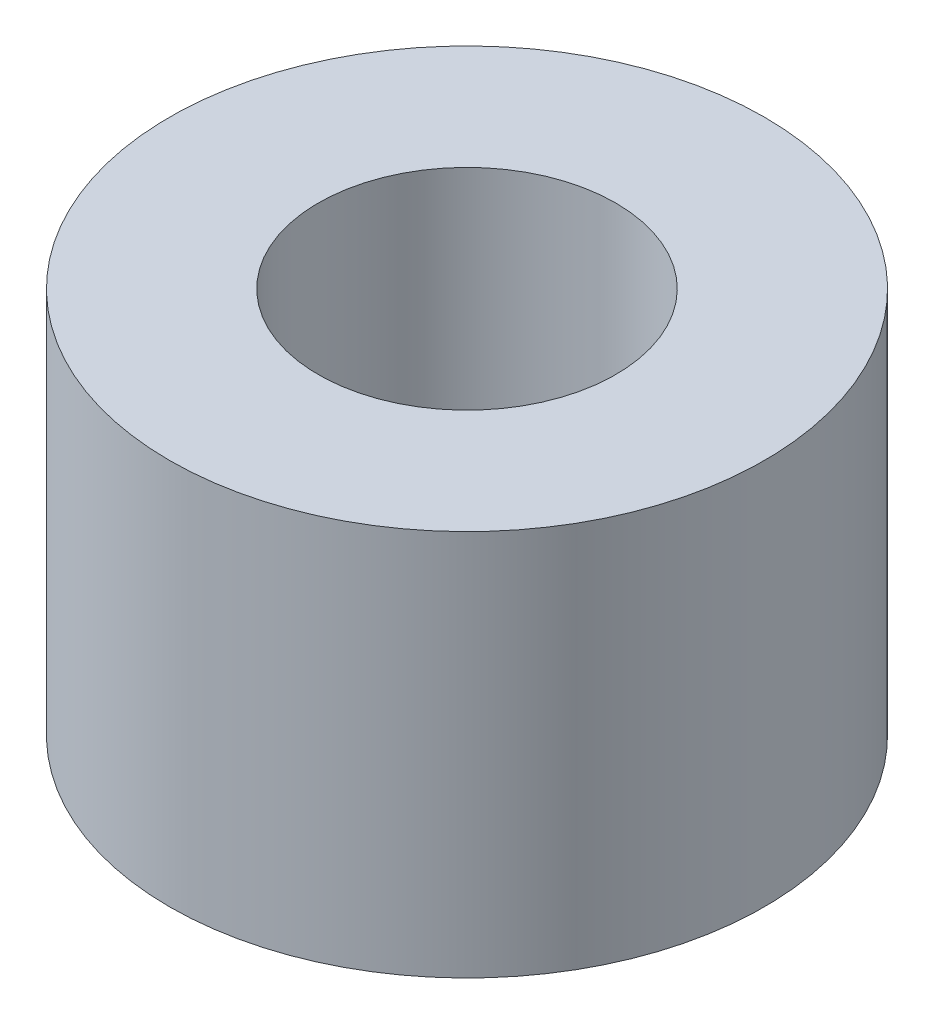
ISO-10303-21;
HEADER;
FILE_DESCRIPTION(('STEP AP214'),'2;1');
FILE_NAME('part.step','',(''),(''),'','','');
FILE_SCHEMA(('AUTOMOTIVE_DESIGN { 1 0 10303 214 1 1 1 1 }'));
ENDSEC;
DATA;
#1=APPLICATION_CONTEXT('core data for automotive mechanical design processes');
#2=APPLICATION_PROTOCOL_DEFINITION('international standard','automotive_design',2000,#1);
#3=PRODUCT_CONTEXT('',#1,'mechanical');
#4=PRODUCT('Part','Part','',(#3));
#5=PRODUCT_RELATED_PRODUCT_CATEGORY('part','',(#4));
#6=PRODUCT_DEFINITION_FORMATION('','',#4);
#7=PRODUCT_DEFINITION_CONTEXT('part definition',#1,'design');
#8=PRODUCT_DEFINITION('design','',#6,#7);
#9=PRODUCT_DEFINITION_SHAPE('','',#8);
#10=(LENGTH_UNIT() NAMED_UNIT(*) SI_UNIT(.MILLI.,.METRE.));
#11=(NAMED_UNIT(*) PLANE_ANGLE_UNIT() SI_UNIT($,.RADIAN.));
#12=(NAMED_UNIT(*) SI_UNIT($,.STERADIAN.) SOLID_ANGLE_UNIT());
#13=UNCERTAINTY_MEASURE_WITH_UNIT(LENGTH_MEASURE(1.E-05),#10,'distance_accuracy_value','');
#14=(GEOMETRIC_REPRESENTATION_CONTEXT(3) GLOBAL_UNCERTAINTY_ASSIGNED_CONTEXT((#13)) GLOBAL_UNIT_ASSIGNED_CONTEXT((#10,
#11,#12)) REPRESENTATION_CONTEXT('',''));
#15=CARTESIAN_POINT('',(0.,0.,0.));
#16=DIRECTION('',(0.,0.,1.));
#17=DIRECTION('',(1.,0.,0.));
#18=AXIS2_PLACEMENT_3D('',#15,#16,#17);
#19=CARTESIAN_POINT('',(0.,13.,0.));
#20=DIRECTION('',(0.,1.,0.));
#21=DIRECTION('',(0.,0.,1.));
#22=AXIS2_PLACEMENT_3D('',#19,#20,#21);
#23=PLANE('',#22);
#24=CARTESIAN_POINT('',(0.,13.,0.));
#25=DIRECTION('',(0.,1.,0.));
#26=DIRECTION('',(0.,0.,1.));
#27=AXIS2_PLACEMENT_3D('',#24,#25,#26);
#28=CIRCLE('',#27,10.);
#29=CARTESIAN_POINT('',(0.,13.,-10.));
#30=VERTEX_POINT('',#29);
#31=EDGE_CURVE('E10',#30,#30,#28,.T.);
#32=ORIENTED_EDGE('',*,*,#31,.T.);
#33=EDGE_LOOP('',(#32));
#34=FACE_BOUND('',#33,.T.);
#35=CARTESIAN_POINT('',(0.,13.,0.));
#36=DIRECTION('',(0.,1.,0.));
#37=DIRECTION('',(0.,0.,1.));
#38=AXIS2_PLACEMENT_3D('',#35,#36,#37);
#39=CIRCLE('',#38,5.);
#40=CARTESIAN_POINT('',(0.,13.,-5.));
#41=VERTEX_POINT('',#40);
#42=EDGE_CURVE('E50',#41,#41,#39,.T.);
#43=ORIENTED_EDGE('',*,*,#42,.F.);
#44=EDGE_LOOP('',(#43));
#45=FACE_BOUND('',#44,.T.);
#46=ADVANCED_FACE('F37',(#34,#45),#23,.T.);
#47=CARTESIAN_POINT('',(0.,0.,0.));
#48=DIRECTION('',(0.,1.,0.));
#49=DIRECTION('',(0.,0.,1.));
#50=AXIS2_PLACEMENT_3D('',#47,#48,#49);
#51=PLANE('',#50);
#52=CARTESIAN_POINT('',(0.,0.,0.));
#53=DIRECTION('',(0.,1.,0.));
#54=DIRECTION('',(0.,0.,1.));
#55=AXIS2_PLACEMENT_3D('',#52,#53,#54);
#56=CIRCLE('',#55,10.);
#57=CARTESIAN_POINT('',(0.,0.,-10.));
#58=VERTEX_POINT('',#57);
#59=EDGE_CURVE('E41',#58,#58,#56,.T.);
#60=ORIENTED_EDGE('',*,*,#59,.F.);
#61=EDGE_LOOP('',(#60));
#62=FACE_BOUND('',#61,.T.);
#63=CARTESIAN_POINT('',(0.,0.,0.));
#64=DIRECTION('',(0.,1.,0.));
#65=DIRECTION('',(0.,0.,1.));
#66=AXIS2_PLACEMENT_3D('',#63,#64,#65);
#67=CIRCLE('',#66,5.);
#68=CARTESIAN_POINT('',(0.,0.,-5.));
#69=VERTEX_POINT('',#68);
#70=EDGE_CURVE('E52',#69,#69,#67,.T.);
#71=ORIENTED_EDGE('',*,*,#70,.T.);
#72=EDGE_LOOP('',(#71));
#73=FACE_BOUND('',#72,.T.);
#74=ADVANCED_FACE('F64',(#62,#73),#51,.F.);
#75=CARTESIAN_POINT('',(0.,13.,0.));
#76=DIRECTION('',(0.,-1.,0.));
#77=DIRECTION('',(0.,0.,-1.));
#78=AXIS2_PLACEMENT_3D('',#75,#76,#77);
#79=CYLINDRICAL_SURFACE('',#78,10.);
#80=CARTESIAN_POINT('',(0.,13.,-10.));
#81=CARTESIAN_POINT('',(0.,12.8645833333333,-10.));
#82=CARTESIAN_POINT('',(0.,12.7291666666667,-10.));
#83=CARTESIAN_POINT('',(0.,12.4583333333333,-10.));
#84=CARTESIAN_POINT('',(0.,12.3229166666667,-10.));
#85=CARTESIAN_POINT('',(0.,12.0520833333333,-10.));
#86=CARTESIAN_POINT('',(0.,11.9166666666667,-10.));
#87=CARTESIAN_POINT('',(0.,11.6458333333333,-10.));
#88=CARTESIAN_POINT('',(0.,11.5104166666667,-10.));
#89=CARTESIAN_POINT('',(0.,11.2395833333333,-10.));
#90=CARTESIAN_POINT('',(0.,11.1041666666667,-10.));
#91=CARTESIAN_POINT('',(0.,10.8333333333333,-10.));
#92=CARTESIAN_POINT('',(0.,10.6979166666667,-10.));
#93=CARTESIAN_POINT('',(0.,10.4270833333333,-10.));
#94=CARTESIAN_POINT('',(0.,10.2916666666667,-10.));
#95=CARTESIAN_POINT('',(0.,10.0208333333333,-10.));
#96=CARTESIAN_POINT('',(0.,9.88541666666667,-10.));
#97=CARTESIAN_POINT('',(0.,9.61458333333333,-10.));
#98=CARTESIAN_POINT('',(0.,9.47916666666667,-10.));
#99=CARTESIAN_POINT('',(0.,9.20833333333333,-10.));
#100=CARTESIAN_POINT('',(0.,9.07291666666666,-10.));
#101=CARTESIAN_POINT('',(0.,8.80208333333333,-10.));
#102=CARTESIAN_POINT('',(0.,8.66666666666667,-10.));
#103=CARTESIAN_POINT('',(0.,8.39583333333333,-10.));
#104=CARTESIAN_POINT('',(0.,8.26041666666667,-10.));
#105=CARTESIAN_POINT('',(0.,7.98958333333333,-10.));
#106=CARTESIAN_POINT('',(0.,7.85416666666667,-10.));
#107=CARTESIAN_POINT('',(0.,7.58333333333333,-10.));
#108=CARTESIAN_POINT('',(0.,7.44791666666667,-10.));
#109=CARTESIAN_POINT('',(0.,7.17708333333333,-10.));
#110=CARTESIAN_POINT('',(0.,7.04166666666667,-10.));
#111=CARTESIAN_POINT('',(0.,6.77083333333333,-10.));
#112=CARTESIAN_POINT('',(0.,6.63541666666667,-10.));
#113=CARTESIAN_POINT('',(0.,6.36458333333333,-10.));
#114=CARTESIAN_POINT('',(0.,6.22916666666667,-10.));
#115=CARTESIAN_POINT('',(0.,5.95833333333333,-10.));
#116=CARTESIAN_POINT('',(0.,5.82291666666667,-10.));
#117=CARTESIAN_POINT('',(0.,5.55208333333333,-10.));
#118=CARTESIAN_POINT('',(0.,5.41666666666667,-10.));
#119=CARTESIAN_POINT('',(0.,5.14583333333333,-10.));
#120=CARTESIAN_POINT('',(0.,5.01041666666667,-10.));
#121=CARTESIAN_POINT('',(0.,4.73958333333333,-10.));
#122=CARTESIAN_POINT('',(0.,4.60416666666667,-10.));
#123=CARTESIAN_POINT('',(0.,4.33333333333333,-10.));
#124=CARTESIAN_POINT('',(0.,4.19791666666667,-10.));
#125=CARTESIAN_POINT('',(0.,3.92708333333333,-10.));
#126=CARTESIAN_POINT('',(0.,3.79166666666667,-10.));
#127=CARTESIAN_POINT('',(0.,3.52083333333333,-10.));
#128=CARTESIAN_POINT('',(0.,3.38541666666667,-10.));
#129=CARTESIAN_POINT('',(0.,3.11458333333333,-10.));
#130=CARTESIAN_POINT('',(0.,2.97916666666667,-10.));
#131=CARTESIAN_POINT('',(0.,2.70833333333333,-10.));
#132=CARTESIAN_POINT('',(0.,2.57291666666667,-10.));
#133=CARTESIAN_POINT('',(0.,2.30208333333333,-10.));
#134=CARTESIAN_POINT('',(0.,2.16666666666667,-10.));
#135=CARTESIAN_POINT('',(0.,1.89583333333333,-10.));
#136=CARTESIAN_POINT('',(0.,1.76041666666667,-10.));
#137=CARTESIAN_POINT('',(0.,1.48958333333333,-10.));
#138=CARTESIAN_POINT('',(0.,1.35416666666667,-10.));
#139=CARTESIAN_POINT('',(0.,1.08333333333333,-10.));
#140=CARTESIAN_POINT('',(0.,0.947916666666667,-10.));
#141=CARTESIAN_POINT('',(0.,0.677083333333334,-10.));
#142=CARTESIAN_POINT('',(0.,0.541666666666667,-10.));
#143=CARTESIAN_POINT('',(0.,0.270833333333334,-10.));
#144=CARTESIAN_POINT('',(0.,0.135416666666667,-10.));
#145=CARTESIAN_POINT('',(0.,0.,-10.));
#146=B_SPLINE_CURVE_WITH_KNOTS('',3,(#80,#81,#82,#83,#84,#85,#86,#87,#88,#89,#90,#91,#92,#93,
#94,#95,#96,#97,#98,#99,#100,#101,#102,#103,#104,#105,#106,#107,#108,#109,#110,#111,#112,#113,
#114,#115,#116,#117,#118,#119,#120,#121,#122,#123,#124,#125,#126,#127,#128,#129,#130,#131,#132,
#133,#134,#135,#136,#137,#138,#139,#140,#141,#142,#143,#144,#145),.UNSPECIFIED.,.F.,.F.,(4,2,2,
2,2,2,2,2,2,2,2,2,2,2,2,2,2,2,2,2,2,2,2,2,2,2,2,2,2,2,2,2,4),(0.,0.40625,0.812500000000001,
1.21875,1.625,2.03125,2.4375,2.84375,3.25,3.65625,4.0625,4.46875,4.875,5.28125,5.6875,6.09375,
6.5,6.90625,7.3125,7.71875,8.125,8.53125,8.9375,9.34375,9.75,10.15625,10.5625,10.96875,11.375,
11.78125,12.1875,12.59375,13.),.UNSPECIFIED.);
#147=EDGE_CURVE('BSEAM39',#30,#58,#146,.T.);
#148=ORIENTED_EDGE('',*,*,#31,.F.);
#149=ORIENTED_EDGE('',*,*,#59,.T.);
#150=ORIENTED_EDGE('',*,*,#147,.T.);
#151=ORIENTED_EDGE('',*,*,#147,.F.);
#152=EDGE_LOOP('',(#148,#150,#149,#151));
#153=FACE_BOUND('',#152,.T.);
#154=ADVANCED_FACE('F39',(#153),#79,.T.);
#155=CARTESIAN_POINT('',(0.,13.,0.));
#156=DIRECTION('',(0.,-1.,0.));
#157=DIRECTION('',(0.,0.,-1.));
#158=AXIS2_PLACEMENT_3D('',#155,#156,#157);
#159=CYLINDRICAL_SURFACE('',#158,5.);
#160=CARTESIAN_POINT('',(0.,13.,-5.));
#161=CARTESIAN_POINT('',(0.,12.8645833333333,-5.));
#162=CARTESIAN_POINT('',(0.,12.7291666666667,-5.));
#163=CARTESIAN_POINT('',(0.,12.4583333333333,-5.));
#164=CARTESIAN_POINT('',(0.,12.3229166666667,-5.));
#165=CARTESIAN_POINT('',(0.,12.0520833333333,-5.));
#166=CARTESIAN_POINT('',(0.,11.9166666666667,-5.));
#167=CARTESIAN_POINT('',(0.,11.6458333333333,-5.));
#168=CARTESIAN_POINT('',(0.,11.5104166666667,-5.));
#169=CARTESIAN_POINT('',(0.,11.2395833333333,-5.));
#170=CARTESIAN_POINT('',(0.,11.1041666666667,-5.));
#171=CARTESIAN_POINT('',(0.,10.8333333333333,-5.));
#172=CARTESIAN_POINT('',(0.,10.6979166666667,-5.));
#173=CARTESIAN_POINT('',(0.,10.4270833333333,-5.));
#174=CARTESIAN_POINT('',(0.,10.2916666666667,-5.));
#175=CARTESIAN_POINT('',(0.,10.0208333333333,-5.));
#176=CARTESIAN_POINT('',(0.,9.88541666666667,-5.));
#177=CARTESIAN_POINT('',(0.,9.61458333333333,-5.));
#178=CARTESIAN_POINT('',(0.,9.47916666666667,-5.));
#179=CARTESIAN_POINT('',(0.,9.20833333333333,-5.));
#180=CARTESIAN_POINT('',(0.,9.07291666666667,-5.));
#181=CARTESIAN_POINT('',(0.,8.80208333333333,-5.));
#182=CARTESIAN_POINT('',(0.,8.66666666666667,-5.));
#183=CARTESIAN_POINT('',(0.,8.39583333333333,-5.));
#184=CARTESIAN_POINT('',(0.,8.26041666666667,-5.));
#185=CARTESIAN_POINT('',(0.,7.98958333333333,-5.));
#186=CARTESIAN_POINT('',(0.,7.85416666666667,-5.));
#187=CARTESIAN_POINT('',(0.,7.58333333333333,-5.));
#188=CARTESIAN_POINT('',(0.,7.44791666666667,-5.));
#189=CARTESIAN_POINT('',(0.,7.17708333333333,-5.));
#190=CARTESIAN_POINT('',(0.,7.04166666666667,-5.));
#191=CARTESIAN_POINT('',(0.,6.77083333333333,-5.));
#192=CARTESIAN_POINT('',(0.,6.63541666666667,-5.));
#193=CARTESIAN_POINT('',(0.,6.36458333333333,-5.));
#194=CARTESIAN_POINT('',(0.,6.22916666666667,-5.));
#195=CARTESIAN_POINT('',(0.,5.95833333333333,-5.));
#196=CARTESIAN_POINT('',(0.,5.82291666666667,-5.));
#197=CARTESIAN_POINT('',(0.,5.55208333333333,-5.));
#198=CARTESIAN_POINT('',(0.,5.41666666666667,-5.));
#199=CARTESIAN_POINT('',(0.,5.14583333333333,-5.));
#200=CARTESIAN_POINT('',(0.,5.01041666666667,-5.));
#201=CARTESIAN_POINT('',(0.,4.73958333333333,-5.));
#202=CARTESIAN_POINT('',(0.,4.60416666666667,-5.));
#203=CARTESIAN_POINT('',(0.,4.33333333333333,-5.));
#204=CARTESIAN_POINT('',(0.,4.19791666666667,-5.));
#205=CARTESIAN_POINT('',(0.,3.92708333333333,-5.));
#206=CARTESIAN_POINT('',(0.,3.79166666666667,-5.));
#207=CARTESIAN_POINT('',(0.,3.52083333333333,-5.));
#208=CARTESIAN_POINT('',(0.,3.38541666666667,-5.));
#209=CARTESIAN_POINT('',(0.,3.11458333333333,-5.));
#210=CARTESIAN_POINT('',(0.,2.97916666666667,-5.));
#211=CARTESIAN_POINT('',(0.,2.70833333333333,-5.));
#212=CARTESIAN_POINT('',(0.,2.57291666666667,-5.));
#213=CARTESIAN_POINT('',(0.,2.30208333333333,-5.));
#214=CARTESIAN_POINT('',(0.,2.16666666666667,-5.));
#215=CARTESIAN_POINT('',(0.,1.89583333333333,-5.));
#216=CARTESIAN_POINT('',(0.,1.76041666666667,-5.));
#217=CARTESIAN_POINT('',(0.,1.48958333333333,-5.));
#218=CARTESIAN_POINT('',(0.,1.35416666666667,-5.));
#219=CARTESIAN_POINT('',(0.,1.08333333333333,-5.));
#220=CARTESIAN_POINT('',(0.,0.947916666666667,-5.));
#221=CARTESIAN_POINT('',(0.,0.677083333333334,-5.));
#222=CARTESIAN_POINT('',(0.,0.541666666666667,-5.));
#223=CARTESIAN_POINT('',(0.,0.270833333333334,-5.));
#224=CARTESIAN_POINT('',(0.,0.135416666666667,-5.));
#225=CARTESIAN_POINT('',(0.,0.,-5.));
#226=B_SPLINE_CURVE_WITH_KNOTS('',3,(#160,#161,#162,#163,#164,#165,#166,#167,#168,#169,#170,
#171,#172,#173,#174,#175,#176,#177,#178,#179,#180,#181,#182,#183,#184,#185,#186,#187,#188,#189,
#190,#191,#192,#193,#194,#195,#196,#197,#198,#199,#200,#201,#202,#203,#204,#205,#206,#207,#208,
#209,#210,#211,#212,#213,#214,#215,#216,#217,#218,#219,#220,#221,#222,#223,#224,#225),
.UNSPECIFIED.,.F.,.F.,(4,2,2,2,2,2,2,2,2,2,2,2,2,2,2,2,2,2,2,2,2,2,2,2,2,2,2,2,2,2,2,2,4),(0.,
0.406249999999999,0.812499999999999,1.21875,1.625,2.03125,2.4375,2.84375,3.25,3.65625,4.0625,
4.46875,4.875,5.28125,5.6875,6.09375,6.5,6.90625,7.3125,7.71875,8.125,8.53125,8.9375,9.34375,
9.75,10.15625,10.5625,10.96875,11.375,11.78125,12.1875,12.59375,13.),.UNSPECIFIED.);
#227=EDGE_CURVE('BSEAM60',#41,#69,#226,.T.);
#228=ORIENTED_EDGE('',*,*,#42,.T.);
#229=ORIENTED_EDGE('',*,*,#70,.F.);
#230=ORIENTED_EDGE('',*,*,#227,.T.);
#231=ORIENTED_EDGE('',*,*,#227,.F.);
#232=EDGE_LOOP('',(#228,#230,#229,#231));
#233=FACE_BOUND('',#232,.T.);
#234=ADVANCED_FACE('F60',(#233),#159,.F.);
#235=CLOSED_SHELL('',(#46,#74,#154,#234));
#236=MANIFOLD_SOLID_BREP('B2',#235);
#237=ADVANCED_BREP_SHAPE_REPRESENTATION('',(#18,#236),#14);
#238=SHAPE_DEFINITION_REPRESENTATION(#9,#237);
ENDSEC;
END-ISO-10303-21;
